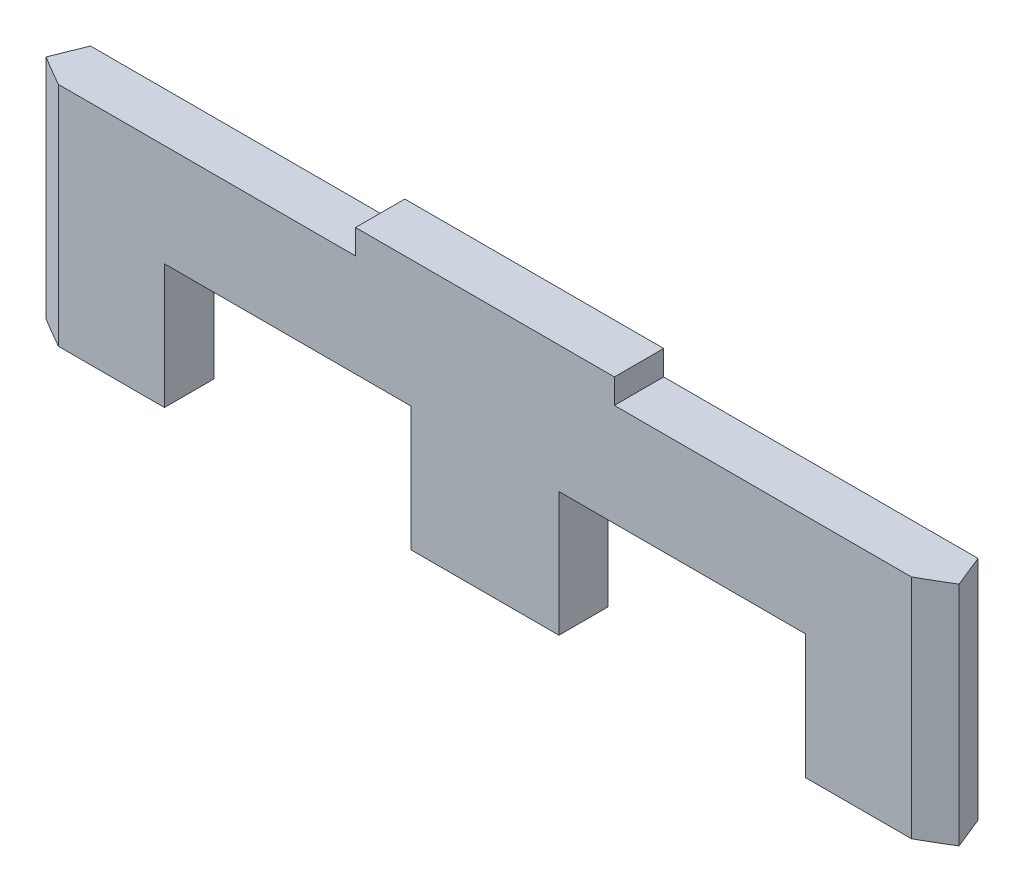
ISO-10303-21;
HEADER;
FILE_DESCRIPTION(('STEP AP214'),'2;1');
FILE_NAME('part.step','',(''),(''),'','','');
FILE_SCHEMA(('AUTOMOTIVE_DESIGN { 1 0 10303 214 1 1 1 1 }'));
ENDSEC;
DATA;
#1=APPLICATION_CONTEXT('core data for automotive mechanical design processes');
#2=APPLICATION_PROTOCOL_DEFINITION('international standard','automotive_design',2000,#1);
#3=PRODUCT_CONTEXT('',#1,'mechanical');
#4=PRODUCT('Part','Part','',(#3));
#5=PRODUCT_RELATED_PRODUCT_CATEGORY('part','',(#4));
#6=PRODUCT_DEFINITION_FORMATION('','',#4);
#7=PRODUCT_DEFINITION_CONTEXT('part definition',#1,'design');
#8=PRODUCT_DEFINITION('design','',#6,#7);
#9=PRODUCT_DEFINITION_SHAPE('','',#8);
#10=(LENGTH_UNIT() NAMED_UNIT(*) SI_UNIT(.MILLI.,.METRE.));
#11=(NAMED_UNIT(*) PLANE_ANGLE_UNIT() SI_UNIT($,.RADIAN.));
#12=(NAMED_UNIT(*) SI_UNIT($,.STERADIAN.) SOLID_ANGLE_UNIT());
#13=UNCERTAINTY_MEASURE_WITH_UNIT(LENGTH_MEASURE(1.E-05),#10,'distance_accuracy_value','');
#14=(GEOMETRIC_REPRESENTATION_CONTEXT(3) GLOBAL_UNCERTAINTY_ASSIGNED_CONTEXT((#13)) GLOBAL_UNIT_ASSIGNED_CONTEXT((#10,
#11,#12)) REPRESENTATION_CONTEXT('',''));
#15=CARTESIAN_POINT('',(0.,0.,0.));
#16=DIRECTION('',(0.,0.,1.));
#17=DIRECTION('',(1.,0.,0.));
#18=AXIS2_PLACEMENT_3D('',#15,#16,#17);
#19=CARTESIAN_POINT('',(18.,-7.125,2.));
#20=DIRECTION('',(0.,1.,0.));
#21=DIRECTION('',(0.,0.,1.));
#22=AXIS2_PLACEMENT_3D('',#19,#20,#21);
#23=PLANE('',#22);
#24=DIRECTION('',(0.374100672913078,0.,0.927388099193634));
#25=VECTOR('',#24,1.);
#26=CARTESIAN_POINT('',(18.8067834237648,-7.12500000000001,2.));
#27=LINE('',#26,#25);
#28=CARTESIAN_POINT('',(18.,-7.12500000000001,0.));
#29=VERTEX_POINT('',#28);
#30=CARTESIAN_POINT('',(18.5191018519169,-7.12500000000001,1.28684312698075));
#31=VERTEX_POINT('',#30);
#32=EDGE_CURVE('E340',#29,#31,#27,.T.);
#33=ORIENTED_EDGE('',*,*,#32,.T.);
#34=CARTESIAN_POINT('',(1.11889664200504E-13,-7.125,-28.9999999999999));
#35=DIRECTION('',(0.,1.,0.));
#36=DIRECTION('',(0.,0.,1.));
#37=AXIS2_PLACEMENT_3D('',#34,#35,#36);
#38=CIRCLE('',#37,35.5);
#39=CARTESIAN_POINT('',(17.2988438920065,-7.12500000000001,2.));
#40=VERTEX_POINT('',#39);
#41=EDGE_CURVE('E62',#40,#31,#38,.T.);
#42=ORIENTED_EDGE('',*,*,#41,.F.);
#43=DIRECTION('',(1.,0.,0.));
#44=VECTOR('',#43,1.);
#45=CARTESIAN_POINT('',(18.,-7.125,2.));
#46=LINE('',#45,#44);
#47=CARTESIAN_POINT('',(13.,-7.125,2.));
#48=VERTEX_POINT('',#47);
#49=EDGE_CURVE('E208',#48,#40,#46,.T.);
#50=ORIENTED_EDGE('',*,*,#49,.F.);
#51=DIRECTION('',(0.,0.,-1.));
#52=VECTOR('',#51,1.);
#53=CARTESIAN_POINT('',(13.,-7.125,2.));
#54=LINE('',#53,#52);
#55=CARTESIAN_POINT('',(13.,-7.125,0.));
#56=VERTEX_POINT('',#55);
#57=EDGE_CURVE('E263',#48,#56,#54,.T.);
#58=ORIENTED_EDGE('',*,*,#57,.T.);
#59=DIRECTION('',(1.,0.,0.));
#60=VECTOR('',#59,1.);
#61=CARTESIAN_POINT('',(18.,-7.125,0.));
#62=LINE('',#61,#60);
#63=EDGE_CURVE('E238',#56,#29,#62,.T.);
#64=ORIENTED_EDGE('',*,*,#63,.T.);
#65=EDGE_LOOP('',(#33,#42,#50,#58,#64));
#66=FACE_BOUND('',#65,.T.);
#67=ADVANCED_FACE('F39',(#66),#23,.F.);
#68=CARTESIAN_POINT('',(5.25,2.075,2.));
#69=DIRECTION('',(0.,-1.,0.));
#70=DIRECTION('',(0.,0.,-1.));
#71=AXIS2_PLACEMENT_3D('',#68,#69,#70);
#72=PLANE('',#71);
#73=DIRECTION('',(-1.,0.,0.));
#74=VECTOR('',#73,1.);
#75=CARTESIAN_POINT('',(5.25,2.075,2.));
#76=LINE('',#75,#74);
#77=CARTESIAN_POINT('',(17.2988438920065,2.075,2.));
#78=VERTEX_POINT('',#77);
#79=CARTESIAN_POINT('',(5.25,2.075,2.));
#80=VERTEX_POINT('',#79);
#81=EDGE_CURVE('E211',#78,#80,#76,.T.);
#82=ORIENTED_EDGE('',*,*,#81,.F.);
#83=CARTESIAN_POINT('',(1.11889664200504E-13,2.075,-28.9999999999999));
#84=DIRECTION('',(0.,-1.,0.));
#85=DIRECTION('',(0.,0.,1.));
#86=AXIS2_PLACEMENT_3D('',#83,#84,#85);
#87=CIRCLE('',#86,35.5);
#88=CARTESIAN_POINT('',(18.5191018519169,2.075,1.28684312698075));
#89=VERTEX_POINT('',#88);
#90=EDGE_CURVE('E178',#89,#78,#87,.T.);
#91=ORIENTED_EDGE('',*,*,#90,.F.);
#92=DIRECTION('',(-0.374100672913078,0.,-0.927388099193634));
#93=VECTOR('',#92,1.);
#94=CARTESIAN_POINT('',(18.8067834237648,2.075,2.));
#95=LINE('',#94,#93);
#96=CARTESIAN_POINT('',(18.,2.075,0.));
#97=VERTEX_POINT('',#96);
#98=EDGE_CURVE('E188',#89,#97,#95,.T.);
#99=ORIENTED_EDGE('',*,*,#98,.T.);
#100=DIRECTION('',(-1.,0.,0.));
#101=VECTOR('',#100,1.);
#102=CARTESIAN_POINT('',(5.25,2.075,0.));
#103=LINE('',#102,#101);
#104=CARTESIAN_POINT('',(5.25,2.075,0.));
#105=VERTEX_POINT('',#104);
#106=EDGE_CURVE('E243',#97,#105,#103,.T.);
#107=ORIENTED_EDGE('',*,*,#106,.T.);
#108=DIRECTION('',(0.,0.,-1.));
#109=VECTOR('',#108,1.);
#110=CARTESIAN_POINT('',(5.25,2.075,2.));
#111=LINE('',#110,#109);
#112=EDGE_CURVE('E260',#80,#105,#111,.T.);
#113=ORIENTED_EDGE('',*,*,#112,.F.);
#114=EDGE_LOOP('',(#82,#91,#99,#107,#113));
#115=FACE_BOUND('',#114,.T.);
#116=ADVANCED_FACE('F331',(#115),#72,.F.);
#117=CARTESIAN_POINT('',(-18.,-7.125,2.));
#118=DIRECTION('',(0.,1.,0.));
#119=DIRECTION('',(-1.,0.,0.));
#120=AXIS2_PLACEMENT_3D('',#117,#118,#119);
#121=PLANE('',#120);
#122=DIRECTION('',(1.,0.,0.));
#123=VECTOR('',#122,1.);
#124=CARTESIAN_POINT('',(-18.,-7.125,2.));
#125=LINE('',#124,#123);
#126=CARTESIAN_POINT('',(-17.2988438920063,-7.125,1.99999999999999));
#127=VERTEX_POINT('',#126);
#128=CARTESIAN_POINT('',(-13.,-7.125,2.));
#129=VERTEX_POINT('',#128);
#130=EDGE_CURVE('E177',#127,#129,#125,.T.);
#131=ORIENTED_EDGE('',*,*,#130,.F.);
#132=CARTESIAN_POINT('',(1.11889664200504E-13,-7.12500000000001,-28.9999999999999));
#133=DIRECTION('',(0.,1.,0.));
#134=DIRECTION('',(-1.,0.,0.));
#135=AXIS2_PLACEMENT_3D('',#132,#133,#134);
#136=CIRCLE('',#135,35.5);
#137=CARTESIAN_POINT('',(-18.5191018519168,-7.125,1.28684312698064));
#138=VERTEX_POINT('',#137);
#139=EDGE_CURVE('E164',#138,#127,#136,.T.);
#140=ORIENTED_EDGE('',*,*,#139,.F.);
#141=DIRECTION('',(0.374100672913078,0.,-0.927388099193634));
#142=VECTOR('',#141,1.);
#143=CARTESIAN_POINT('',(-18.,-7.125,0.));
#144=LINE('',#143,#142);
#145=CARTESIAN_POINT('',(-18.,-7.125,0.));
#146=VERTEX_POINT('',#145);
#147=EDGE_CURVE('E174',#138,#146,#144,.T.);
#148=ORIENTED_EDGE('',*,*,#147,.T.);
#149=DIRECTION('',(1.,0.,0.));
#150=VECTOR('',#149,1.);
#151=CARTESIAN_POINT('',(-18.,-7.125,0.));
#152=LINE('',#151,#150);
#153=CARTESIAN_POINT('',(-13.,-7.125,0.));
#154=VERTEX_POINT('',#153);
#155=EDGE_CURVE('E186',#146,#154,#152,.T.);
#156=ORIENTED_EDGE('',*,*,#155,.T.);
#157=DIRECTION('',(0.,0.,-1.));
#158=VECTOR('',#157,1.);
#159=CARTESIAN_POINT('',(-13.,-7.125,2.));
#160=LINE('',#159,#158);
#161=EDGE_CURVE('E11',#129,#154,#160,.T.);
#162=ORIENTED_EDGE('',*,*,#161,.F.);
#163=EDGE_LOOP('',(#131,#140,#148,#156,#162));
#164=FACE_BOUND('',#163,.T.);
#165=ADVANCED_FACE('F41',(#164),#121,.F.);
#166=CARTESIAN_POINT('',(-13.,-2.075,2.));
#167=DIRECTION('',(-1.,0.,0.));
#168=DIRECTION('',(0.,-1.,0.));
#169=AXIS2_PLACEMENT_3D('',#166,#167,#168);
#170=PLANE('',#169);
#171=DIRECTION('',(0.,1.,0.));
#172=VECTOR('',#171,1.);
#173=CARTESIAN_POINT('',(-13.,-2.075,0.));
#174=LINE('',#173,#172);
#175=CARTESIAN_POINT('',(-13.,-2.075,0.));
#176=VERTEX_POINT('',#175);
#177=EDGE_CURVE('E224',#154,#176,#174,.T.);
#178=ORIENTED_EDGE('',*,*,#177,.T.);
#179=DIRECTION('',(0.,0.,-1.));
#180=VECTOR('',#179,1.);
#181=CARTESIAN_POINT('',(-13.,-2.075,2.));
#182=LINE('',#181,#180);
#183=CARTESIAN_POINT('',(-13.,-2.075,2.));
#184=VERTEX_POINT('',#183);
#185=EDGE_CURVE('E47',#184,#176,#182,.T.);
#186=ORIENTED_EDGE('',*,*,#185,.F.);
#187=DIRECTION('',(0.,1.,0.));
#188=VECTOR('',#187,1.);
#189=CARTESIAN_POINT('',(-13.,-2.075,2.));
#190=LINE('',#189,#188);
#191=EDGE_CURVE('E193',#129,#184,#190,.T.);
#192=ORIENTED_EDGE('',*,*,#191,.F.);
#193=ORIENTED_EDGE('',*,*,#161,.T.);
#194=EDGE_LOOP('',(#178,#186,#192,#193));
#195=FACE_BOUND('',#194,.T.);
#196=ADVANCED_FACE('F307',(#195),#170,.F.);
#197=CARTESIAN_POINT('',(-13.,-2.075,2.));
#198=DIRECTION('',(0.,1.,0.));
#199=DIRECTION('',(0.,0.,1.));
#200=AXIS2_PLACEMENT_3D('',#197,#198,#199);
#201=PLANE('',#200);
#202=DIRECTION('',(1.,0.,0.));
#203=VECTOR('',#202,1.);
#204=CARTESIAN_POINT('',(-13.,-2.075,0.));
#205=LINE('',#204,#203);
#206=CARTESIAN_POINT('',(-2.99999999999999,-2.075,0.));
#207=VERTEX_POINT('',#206);
#208=EDGE_CURVE('E226',#176,#207,#205,.T.);
#209=ORIENTED_EDGE('',*,*,#208,.T.);
#210=DIRECTION('',(0.,0.,-1.));
#211=VECTOR('',#210,1.);
#212=CARTESIAN_POINT('',(-2.99999999999999,-2.075,2.));
#213=LINE('',#212,#211);
#214=CARTESIAN_POINT('',(-2.99999999999999,-2.075,2.));
#215=VERTEX_POINT('',#214);
#216=EDGE_CURVE('E278',#215,#207,#213,.T.);
#217=ORIENTED_EDGE('',*,*,#216,.F.);
#218=DIRECTION('',(1.,0.,0.));
#219=VECTOR('',#218,1.);
#220=CARTESIAN_POINT('',(-13.,-2.075,2.));
#221=LINE('',#220,#219);
#222=EDGE_CURVE('E196',#184,#215,#221,.T.);
#223=ORIENTED_EDGE('',*,*,#222,.F.);
#224=ORIENTED_EDGE('',*,*,#185,.T.);
#225=EDGE_LOOP('',(#209,#217,#223,#224));
#226=FACE_BOUND('',#225,.T.);
#227=ADVANCED_FACE('F285',(#226),#201,.F.);
#228=CARTESIAN_POINT('',(-2.99999999999999,-2.075,2.));
#229=DIRECTION('',(1.,0.,0.));
#230=DIRECTION('',(0.,1.,0.));
#231=AXIS2_PLACEMENT_3D('',#228,#229,#230);
#232=PLANE('',#231);
#233=DIRECTION('',(0.,-1.,0.));
#234=VECTOR('',#233,1.);
#235=CARTESIAN_POINT('',(-2.99999999999999,-2.075,0.));
#236=LINE('',#235,#234);
#237=CARTESIAN_POINT('',(-2.99999999999999,-7.125,0.));
#238=VERTEX_POINT('',#237);
#239=EDGE_CURVE('E228',#207,#238,#236,.T.);
#240=ORIENTED_EDGE('',*,*,#239,.T.);
#241=DIRECTION('',(0.,0.,-1.));
#242=VECTOR('',#241,1.);
#243=CARTESIAN_POINT('',(-2.99999999999999,-7.125,2.));
#244=LINE('',#243,#242);
#245=CARTESIAN_POINT('',(-2.99999999999999,-7.125,2.));
#246=VERTEX_POINT('',#245);
#247=EDGE_CURVE('E275',#246,#238,#244,.T.);
#248=ORIENTED_EDGE('',*,*,#247,.F.);
#249=DIRECTION('',(0.,-1.,0.));
#250=VECTOR('',#249,1.);
#251=CARTESIAN_POINT('',(-2.99999999999999,-2.075,2.));
#252=LINE('',#251,#250);
#253=EDGE_CURVE('E198',#215,#246,#252,.T.);
#254=ORIENTED_EDGE('',*,*,#253,.F.);
#255=ORIENTED_EDGE('',*,*,#216,.T.);
#256=EDGE_LOOP('',(#240,#248,#254,#255));
#257=FACE_BOUND('',#256,.T.);
#258=ADVANCED_FACE('F297',(#257),#232,.F.);
#259=CARTESIAN_POINT('',(3.00000000000001,-7.125,2.));
#260=DIRECTION('',(0.,1.,0.));
#261=DIRECTION('',(0.,0.,1.));
#262=AXIS2_PLACEMENT_3D('',#259,#260,#261);
#263=PLANE('',#262);
#264=DIRECTION('',(1.,0.,0.));
#265=VECTOR('',#264,1.);
#266=CARTESIAN_POINT('',(3.00000000000001,-7.125,0.));
#267=LINE('',#266,#265);
#268=CARTESIAN_POINT('',(3.00000000000001,-7.125,0.));
#269=VERTEX_POINT('',#268);
#270=EDGE_CURVE('E230',#238,#269,#267,.T.);
#271=ORIENTED_EDGE('',*,*,#270,.T.);
#272=DIRECTION('',(0.,0.,-1.));
#273=VECTOR('',#272,1.);
#274=CARTESIAN_POINT('',(3.00000000000001,-7.125,2.));
#275=LINE('',#274,#273);
#276=CARTESIAN_POINT('',(3.00000000000001,-7.125,2.));
#277=VERTEX_POINT('',#276);
#278=EDGE_CURVE('E272',#277,#269,#275,.T.);
#279=ORIENTED_EDGE('',*,*,#278,.F.);
#280=DIRECTION('',(1.,0.,0.));
#281=VECTOR('',#280,1.);
#282=CARTESIAN_POINT('',(3.00000000000001,-7.125,2.));
#283=LINE('',#282,#281);
#284=EDGE_CURVE('E200',#246,#277,#283,.T.);
#285=ORIENTED_EDGE('',*,*,#284,.F.);
#286=ORIENTED_EDGE('',*,*,#247,.T.);
#287=EDGE_LOOP('',(#271,#279,#285,#286));
#288=FACE_BOUND('',#287,.T.);
#289=ADVANCED_FACE('F301',(#288),#263,.F.);
#290=CARTESIAN_POINT('',(3.00000000000001,-2.075,2.));
#291=DIRECTION('',(-1.,0.,0.));
#292=DIRECTION('',(0.,-1.,0.));
#293=AXIS2_PLACEMENT_3D('',#290,#291,#292);
#294=PLANE('',#293);
#295=DIRECTION('',(0.,1.,0.));
#296=VECTOR('',#295,1.);
#297=CARTESIAN_POINT('',(3.00000000000001,-2.075,0.));
#298=LINE('',#297,#296);
#299=CARTESIAN_POINT('',(3.00000000000001,-2.075,0.));
#300=VERTEX_POINT('',#299);
#301=EDGE_CURVE('E232',#269,#300,#298,.T.);
#302=ORIENTED_EDGE('',*,*,#301,.T.);
#303=DIRECTION('',(0.,0.,-1.));
#304=VECTOR('',#303,1.);
#305=CARTESIAN_POINT('',(3.00000000000001,-2.075,2.));
#306=LINE('',#305,#304);
#307=CARTESIAN_POINT('',(3.00000000000001,-2.075,2.));
#308=VERTEX_POINT('',#307);
#309=EDGE_CURVE('E269',#308,#300,#306,.T.);
#310=ORIENTED_EDGE('',*,*,#309,.F.);
#311=DIRECTION('',(0.,1.,0.));
#312=VECTOR('',#311,1.);
#313=CARTESIAN_POINT('',(3.00000000000001,-2.075,2.));
#314=LINE('',#313,#312);
#315=EDGE_CURVE('E202',#277,#308,#314,.T.);
#316=ORIENTED_EDGE('',*,*,#315,.F.);
#317=ORIENTED_EDGE('',*,*,#278,.T.);
#318=EDGE_LOOP('',(#302,#310,#316,#317));
#319=FACE_BOUND('',#318,.T.);
#320=ADVANCED_FACE('F365',(#319),#294,.F.);
#321=CARTESIAN_POINT('',(3.00000000000001,-2.075,2.));
#322=DIRECTION('',(0.,1.,0.));
#323=DIRECTION('',(0.,0.,1.));
#324=AXIS2_PLACEMENT_3D('',#321,#322,#323);
#325=PLANE('',#324);
#326=DIRECTION('',(1.,0.,0.));
#327=VECTOR('',#326,1.);
#328=CARTESIAN_POINT('',(3.00000000000001,-2.075,0.));
#329=LINE('',#328,#327);
#330=CARTESIAN_POINT('',(13.,-2.075,0.));
#331=VERTEX_POINT('',#330);
#332=EDGE_CURVE('E234',#300,#331,#329,.T.);
#333=ORIENTED_EDGE('',*,*,#332,.T.);
#334=DIRECTION('',(0.,0.,-1.));
#335=VECTOR('',#334,1.);
#336=CARTESIAN_POINT('',(13.,-2.075,2.));
#337=LINE('',#336,#335);
#338=CARTESIAN_POINT('',(13.,-2.075,2.));
#339=VERTEX_POINT('',#338);
#340=EDGE_CURVE('E266',#339,#331,#337,.T.);
#341=ORIENTED_EDGE('',*,*,#340,.F.);
#342=DIRECTION('',(1.,0.,0.));
#343=VECTOR('',#342,1.);
#344=CARTESIAN_POINT('',(3.00000000000001,-2.075,2.));
#345=LINE('',#344,#343);
#346=EDGE_CURVE('E204',#308,#339,#345,.T.);
#347=ORIENTED_EDGE('',*,*,#346,.F.);
#348=ORIENTED_EDGE('',*,*,#309,.T.);
#349=EDGE_LOOP('',(#333,#341,#347,#348));
#350=FACE_BOUND('',#349,.T.);
#351=ADVANCED_FACE('F363',(#350),#325,.F.);
#352=CARTESIAN_POINT('',(13.,-2.075,2.));
#353=DIRECTION('',(1.,0.,0.));
#354=DIRECTION('',(0.,1.,0.));
#355=AXIS2_PLACEMENT_3D('',#352,#353,#354);
#356=PLANE('',#355);
#357=DIRECTION('',(0.,-1.,0.));
#358=VECTOR('',#357,1.);
#359=CARTESIAN_POINT('',(13.,-2.075,0.));
#360=LINE('',#359,#358);
#361=EDGE_CURVE('E236',#331,#56,#360,.T.);
#362=ORIENTED_EDGE('',*,*,#361,.T.);
#363=ORIENTED_EDGE('',*,*,#57,.F.);
#364=DIRECTION('',(0.,-1.,0.));
#365=VECTOR('',#364,1.);
#366=CARTESIAN_POINT('',(13.,-2.075,2.));
#367=LINE('',#366,#365);
#368=EDGE_CURVE('E206',#339,#48,#367,.T.);
#369=ORIENTED_EDGE('',*,*,#368,.F.);
#370=ORIENTED_EDGE('',*,*,#340,.T.);
#371=EDGE_LOOP('',(#362,#363,#369,#370));
#372=FACE_BOUND('',#371,.T.);
#373=ADVANCED_FACE('F359',(#372),#356,.F.);
#374=CARTESIAN_POINT('',(5.25,2.075,2.));
#375=DIRECTION('',(-1.,0.,0.));
#376=DIRECTION('',(0.,0.,1.));
#377=AXIS2_PLACEMENT_3D('',#374,#375,#376);
#378=PLANE('',#377);
#379=DIRECTION('',(0.,1.,0.));
#380=VECTOR('',#379,1.);
#381=CARTESIAN_POINT('',(5.25,2.075,0.));
#382=LINE('',#381,#380);
#383=CARTESIAN_POINT('',(5.25,3.075,0.));
#384=VERTEX_POINT('',#383);
#385=EDGE_CURVE('E245',#105,#384,#382,.T.);
#386=ORIENTED_EDGE('',*,*,#385,.T.);
#387=DIRECTION('',(0.,0.,-1.));
#388=VECTOR('',#387,1.);
#389=CARTESIAN_POINT('',(5.25,3.075,2.));
#390=LINE('',#389,#388);
#391=CARTESIAN_POINT('',(5.25,3.075,2.));
#392=VERTEX_POINT('',#391);
#393=EDGE_CURVE('E257',#392,#384,#390,.T.);
#394=ORIENTED_EDGE('',*,*,#393,.F.);
#395=DIRECTION('',(0.,1.,0.));
#396=VECTOR('',#395,1.);
#397=CARTESIAN_POINT('',(5.25,2.075,2.));
#398=LINE('',#397,#396);
#399=EDGE_CURVE('E213',#80,#392,#398,.T.);
#400=ORIENTED_EDGE('',*,*,#399,.F.);
#401=ORIENTED_EDGE('',*,*,#112,.T.);
#402=EDGE_LOOP('',(#386,#394,#400,#401));
#403=FACE_BOUND('',#402,.T.);
#404=ADVANCED_FACE('F327',(#403),#378,.F.);
#405=CARTESIAN_POINT('',(-5.25,3.075,2.));
#406=DIRECTION('',(0.,-1.,0.));
#407=DIRECTION('',(0.,0.,-1.));
#408=AXIS2_PLACEMENT_3D('',#405,#406,#407);
#409=PLANE('',#408);
#410=DIRECTION('',(-1.,0.,0.));
#411=VECTOR('',#410,1.);
#412=CARTESIAN_POINT('',(-5.25,3.075,0.));
#413=LINE('',#412,#411);
#414=CARTESIAN_POINT('',(-5.25,3.075,0.));
#415=VERTEX_POINT('',#414);
#416=EDGE_CURVE('E247',#384,#415,#413,.T.);
#417=ORIENTED_EDGE('',*,*,#416,.T.);
#418=DIRECTION('',(0.,0.,-1.));
#419=VECTOR('',#418,1.);
#420=CARTESIAN_POINT('',(-5.25,3.075,2.));
#421=LINE('',#420,#419);
#422=CARTESIAN_POINT('',(-5.25,3.075,2.));
#423=VERTEX_POINT('',#422);
#424=EDGE_CURVE('E254',#423,#415,#421,.T.);
#425=ORIENTED_EDGE('',*,*,#424,.F.);
#426=DIRECTION('',(-1.,0.,0.));
#427=VECTOR('',#426,1.);
#428=CARTESIAN_POINT('',(-5.25,3.075,2.));
#429=LINE('',#428,#427);
#430=EDGE_CURVE('E215',#392,#423,#429,.T.);
#431=ORIENTED_EDGE('',*,*,#430,.F.);
#432=ORIENTED_EDGE('',*,*,#393,.T.);
#433=EDGE_LOOP('',(#417,#425,#431,#432));
#434=FACE_BOUND('',#433,.T.);
#435=ADVANCED_FACE('F322',(#434),#409,.F.);
#436=CARTESIAN_POINT('',(-5.25,2.075,2.));
#437=DIRECTION('',(1.,0.,0.));
#438=DIRECTION('',(0.,0.,-1.));
#439=AXIS2_PLACEMENT_3D('',#436,#437,#438);
#440=PLANE('',#439);
#441=DIRECTION('',(0.,-1.,0.));
#442=VECTOR('',#441,1.);
#443=CARTESIAN_POINT('',(-5.25,2.075,0.));
#444=LINE('',#443,#442);
#445=CARTESIAN_POINT('',(-5.25,2.075,0.));
#446=VERTEX_POINT('',#445);
#447=EDGE_CURVE('E249',#415,#446,#444,.T.);
#448=ORIENTED_EDGE('',*,*,#447,.T.);
#449=DIRECTION('',(0.,0.,-1.));
#450=VECTOR('',#449,1.);
#451=CARTESIAN_POINT('',(-5.25,2.075,2.));
#452=LINE('',#451,#450);
#453=CARTESIAN_POINT('',(-5.25,2.075,2.));
#454=VERTEX_POINT('',#453);
#455=EDGE_CURVE('E221',#454,#446,#452,.T.);
#456=ORIENTED_EDGE('',*,*,#455,.F.);
#457=DIRECTION('',(0.,-1.,0.));
#458=VECTOR('',#457,1.);
#459=CARTESIAN_POINT('',(-5.25,2.075,2.));
#460=LINE('',#459,#458);
#461=EDGE_CURVE('E217',#423,#454,#460,.T.);
#462=ORIENTED_EDGE('',*,*,#461,.F.);
#463=ORIENTED_EDGE('',*,*,#424,.T.);
#464=EDGE_LOOP('',(#448,#456,#462,#463));
#465=FACE_BOUND('',#464,.T.);
#466=ADVANCED_FACE('F316',(#465),#440,.F.);
#467=CARTESIAN_POINT('',(-18.,2.075,2.));
#468=DIRECTION('',(0.,-1.,0.));
#469=DIRECTION('',(0.,0.,-1.));
#470=AXIS2_PLACEMENT_3D('',#467,#468,#469);
#471=PLANE('',#470);
#472=DIRECTION('',(-0.374100672913078,0.,0.927388099193634));
#473=VECTOR('',#472,1.);
#474=CARTESIAN_POINT('',(-18.,2.075,0.));
#475=LINE('',#474,#473);
#476=CARTESIAN_POINT('',(-18.,2.075,0.));
#477=VERTEX_POINT('',#476);
#478=CARTESIAN_POINT('',(-18.5191018519168,2.075,1.28684312698064));
#479=VERTEX_POINT('',#478);
#480=EDGE_CURVE('E184',#477,#479,#475,.T.);
#481=ORIENTED_EDGE('',*,*,#480,.T.);
#482=CARTESIAN_POINT('',(1.11889664200504E-13,2.075,-28.9999999999999));
#483=DIRECTION('',(0.,-1.,0.));
#484=DIRECTION('',(0.,0.,1.));
#485=AXIS2_PLACEMENT_3D('',#482,#483,#484);
#486=CIRCLE('',#485,35.5);
#487=CARTESIAN_POINT('',(-17.2988438920063,2.075,1.99999999999999));
#488=VERTEX_POINT('',#487);
#489=EDGE_CURVE('E54',#488,#479,#486,.T.);
#490=ORIENTED_EDGE('',*,*,#489,.F.);
#491=DIRECTION('',(-1.,0.,0.));
#492=VECTOR('',#491,1.);
#493=CARTESIAN_POINT('',(-18.,2.075,2.));
#494=LINE('',#493,#492);
#495=EDGE_CURVE('E219',#454,#488,#494,.T.);
#496=ORIENTED_EDGE('',*,*,#495,.F.);
#497=ORIENTED_EDGE('',*,*,#455,.T.);
#498=DIRECTION('',(-1.,0.,0.));
#499=VECTOR('',#498,1.);
#500=CARTESIAN_POINT('',(-18.,2.075,0.));
#501=LINE('',#500,#499);
#502=EDGE_CURVE('E194',#446,#477,#501,.T.);
#503=ORIENTED_EDGE('',*,*,#502,.T.);
#504=EDGE_LOOP('',(#481,#490,#496,#497,#503));
#505=FACE_BOUND('',#504,.T.);
#506=ADVANCED_FACE('F311',(#505),#471,.F.);
#507=CARTESIAN_POINT('',(0.,0.,2.));
#508=DIRECTION('',(0.,0.,1.));
#509=DIRECTION('',(1.,0.,0.));
#510=AXIS2_PLACEMENT_3D('',#507,#508,#509);
#511=PLANE('',#510);
#512=DIRECTION('',(0.,1.,0.));
#513=VECTOR('',#512,1.);
#514=CARTESIAN_POINT('',(-17.2988438920063,-7.12600000000001,1.99999999999999));
#515=LINE('',#514,#513);
#516=EDGE_CURVE('E170',#127,#488,#515,.T.);
#517=ORIENTED_EDGE('',*,*,#516,.F.);
#518=ORIENTED_EDGE('',*,*,#130,.T.);
#519=ORIENTED_EDGE('',*,*,#191,.T.);
#520=ORIENTED_EDGE('',*,*,#222,.T.);
#521=ORIENTED_EDGE('',*,*,#253,.T.);
#522=ORIENTED_EDGE('',*,*,#284,.T.);
#523=ORIENTED_EDGE('',*,*,#315,.T.);
#524=ORIENTED_EDGE('',*,*,#346,.T.);
#525=ORIENTED_EDGE('',*,*,#368,.T.);
#526=ORIENTED_EDGE('',*,*,#49,.T.);
#527=DIRECTION('',(0.,1.,0.));
#528=VECTOR('',#527,1.);
#529=CARTESIAN_POINT('',(17.2988438920065,-7.12600000000001,2.));
#530=LINE('',#529,#528);
#531=EDGE_CURVE('E347',#40,#78,#530,.T.);
#532=ORIENTED_EDGE('',*,*,#531,.T.);
#533=ORIENTED_EDGE('',*,*,#81,.T.);
#534=ORIENTED_EDGE('',*,*,#399,.T.);
#535=ORIENTED_EDGE('',*,*,#430,.T.);
#536=ORIENTED_EDGE('',*,*,#461,.T.);
#537=ORIENTED_EDGE('',*,*,#495,.T.);
#538=EDGE_LOOP('',(#517,#518,#519,#520,#521,#522,#523,#524,#525,#526,#532,#533,#534,#535,#536,#537));
#539=FACE_BOUND('',#538,.T.);
#540=ADVANCED_FACE('F305',(#539),#511,.T.);
#541=CARTESIAN_POINT('',(0.,0.,0.));
#542=DIRECTION('',(0.,0.,1.));
#543=DIRECTION('',(1.,0.,0.));
#544=AXIS2_PLACEMENT_3D('',#541,#542,#543);
#545=PLANE('',#544);
#546=DIRECTION('',(0.,-1.,0.));
#547=VECTOR('',#546,1.);
#548=CARTESIAN_POINT('',(-18.,-2.075,0.));
#549=LINE('',#548,#547);
#550=EDGE_CURVE('E183',#477,#146,#549,.T.);
#551=ORIENTED_EDGE('',*,*,#550,.F.);
#552=ORIENTED_EDGE('',*,*,#502,.F.);
#553=ORIENTED_EDGE('',*,*,#447,.F.);
#554=ORIENTED_EDGE('',*,*,#416,.F.);
#555=ORIENTED_EDGE('',*,*,#385,.F.);
#556=ORIENTED_EDGE('',*,*,#106,.F.);
#557=DIRECTION('',(0.,1.,0.));
#558=VECTOR('',#557,1.);
#559=CARTESIAN_POINT('',(18.,2.075,0.));
#560=LINE('',#559,#558);
#561=EDGE_CURVE('E240',#29,#97,#560,.T.);
#562=ORIENTED_EDGE('',*,*,#561,.F.);
#563=ORIENTED_EDGE('',*,*,#63,.F.);
#564=ORIENTED_EDGE('',*,*,#361,.F.);
#565=ORIENTED_EDGE('',*,*,#332,.F.);
#566=ORIENTED_EDGE('',*,*,#301,.F.);
#567=ORIENTED_EDGE('',*,*,#270,.F.);
#568=ORIENTED_EDGE('',*,*,#239,.F.);
#569=ORIENTED_EDGE('',*,*,#208,.F.);
#570=ORIENTED_EDGE('',*,*,#177,.F.);
#571=ORIENTED_EDGE('',*,*,#155,.F.);
#572=EDGE_LOOP('',(#551,#552,#553,#554,#555,#556,#562,#563,#564,#565,#566,#567,#568,#569,#570,#571));
#573=FACE_BOUND('',#572,.T.);
#574=ADVANCED_FACE('F292',(#573),#545,.F.);
#575=CARTESIAN_POINT('',(-18.,-9.28159442011281,0.));
#576=DIRECTION('',(-0.927388099193634,0.,-0.374100672913078));
#577=DIRECTION('',(-0.374100672913078,0.,0.927388099193634));
#578=AXIS2_PLACEMENT_3D('',#575,#576,#577);
#579=PLANE('',#578);
#580=DIRECTION('',(0.,1.,0.));
#581=VECTOR('',#580,1.);
#582=CARTESIAN_POINT('',(-18.5191018519168,-7.12600000000001,1.28684312698064));
#583=LINE('',#582,#581);
#584=EDGE_CURVE('E161',#138,#479,#583,.T.);
#585=ORIENTED_EDGE('',*,*,#584,.T.);
#586=ORIENTED_EDGE('',*,*,#480,.F.);
#587=ORIENTED_EDGE('',*,*,#550,.T.);
#588=ORIENTED_EDGE('',*,*,#147,.F.);
#589=EDGE_LOOP('',(#585,#586,#587,#588));
#590=FACE_BOUND('',#589,.T.);
#591=ADVANCED_FACE('F181',(#590),#579,.T.);
#592=CARTESIAN_POINT('',(18.8067834237648,-9.28159442011281,2.));
#593=DIRECTION('',(0.927388099193634,0.,-0.374100672913078));
#594=DIRECTION('',(-0.374100672913078,0.,-0.927388099193634));
#595=AXIS2_PLACEMENT_3D('',#592,#593,#594);
#596=PLANE('',#595);
#597=DIRECTION('',(0.,1.,0.));
#598=VECTOR('',#597,1.);
#599=CARTESIAN_POINT('',(18.5191018519169,-7.12600000000001,1.28684312698075));
#600=LINE('',#599,#598);
#601=EDGE_CURVE('E341',#31,#89,#600,.T.);
#602=ORIENTED_EDGE('',*,*,#601,.F.);
#603=ORIENTED_EDGE('',*,*,#32,.F.);
#604=ORIENTED_EDGE('',*,*,#561,.T.);
#605=ORIENTED_EDGE('',*,*,#98,.F.);
#606=EDGE_LOOP('',(#602,#603,#604,#605));
#607=FACE_BOUND('',#606,.T.);
#608=ADVANCED_FACE('F338',(#607),#596,.T.);
#609=CARTESIAN_POINT('',(1.11889664200504E-13,-7.12600000000001,-28.9999999999999));
#610=DIRECTION('',(0.,1.,0.));
#611=DIRECTION('',(0.,0.,1.));
#612=AXIS2_PLACEMENT_3D('',#609,#610,#611);
#613=CYLINDRICAL_SURFACE('',#612,35.5);
#614=ORIENTED_EDGE('',*,*,#41,.T.);
#615=ORIENTED_EDGE('',*,*,#601,.T.);
#616=ORIENTED_EDGE('',*,*,#90,.T.);
#617=ORIENTED_EDGE('',*,*,#531,.F.);
#618=EDGE_LOOP('',(#614,#615,#616,#617));
#619=FACE_BOUND('',#618,.T.);
#620=ADVANCED_FACE('F352',(#619),#613,.T.);
#621=CARTESIAN_POINT('',(1.11889664200504E-13,-7.12600000000001,-28.9999999999999));
#622=DIRECTION('',(0.,1.,0.));
#623=DIRECTION('',(0.,0.,1.));
#624=AXIS2_PLACEMENT_3D('',#621,#622,#623);
#625=CYLINDRICAL_SURFACE('',#624,35.5);
#626=ORIENTED_EDGE('',*,*,#139,.T.);
#627=ORIENTED_EDGE('',*,*,#516,.T.);
#628=ORIENTED_EDGE('',*,*,#489,.T.);
#629=ORIENTED_EDGE('',*,*,#584,.F.);
#630=EDGE_LOOP('',(#626,#627,#628,#629));
#631=FACE_BOUND('',#630,.T.);
#632=ADVANCED_FACE('F163',(#631),#625,.T.);
#633=CLOSED_SHELL('',(#67,#116,#165,#196,#227,#258,#289,#320,#351,#373,#404,#435,#466,#506,#540,
#574,#591,#608,#620,#632));
#634=MANIFOLD_SOLID_BREP('B2',#633);
#635=ADVANCED_BREP_SHAPE_REPRESENTATION('',(#18,#634),#14);
#636=SHAPE_DEFINITION_REPRESENTATION(#9,#635);
ENDSEC;
END-ISO-10303-21;
